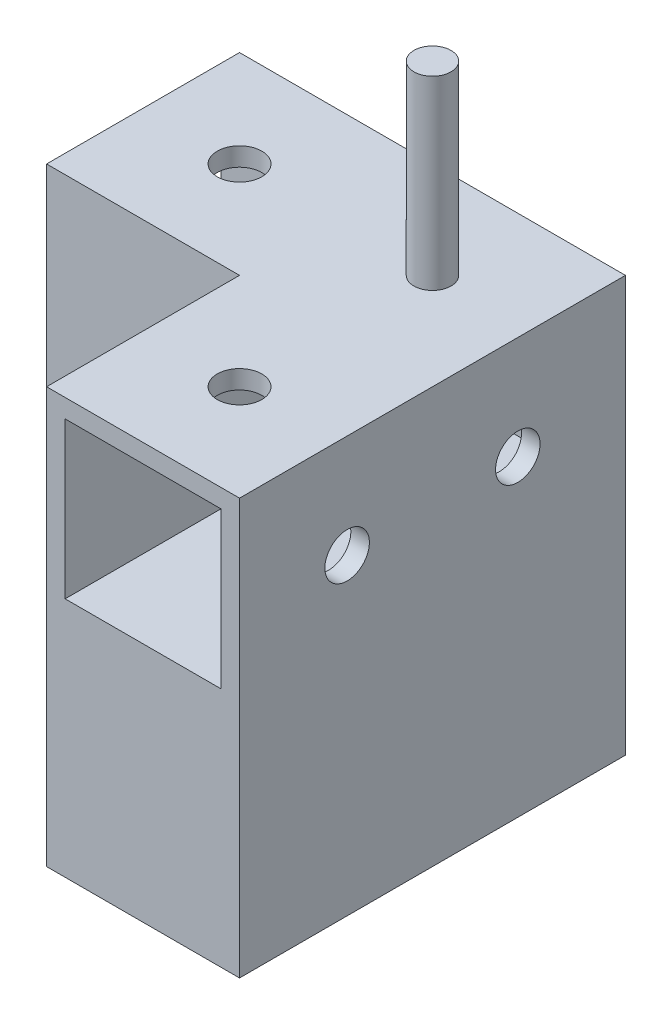
ISO-10303-21;
HEADER;
FILE_DESCRIPTION(('STEP AP214'),'2;1');
FILE_NAME('part.step','',(''),(''),'','','');
FILE_SCHEMA(('AUTOMOTIVE_DESIGN { 1 0 10303 214 1 1 1 1 }'));
ENDSEC;
DATA;
#1=APPLICATION_CONTEXT('core data for automotive mechanical design processes');
#2=APPLICATION_PROTOCOL_DEFINITION('international standard','automotive_design',2000,#1);
#3=PRODUCT_CONTEXT('',#1,'mechanical');
#4=PRODUCT('Part','Part','',(#3));
#5=PRODUCT_RELATED_PRODUCT_CATEGORY('part','',(#4));
#6=PRODUCT_DEFINITION_FORMATION('','',#4);
#7=PRODUCT_DEFINITION_CONTEXT('part definition',#1,'design');
#8=PRODUCT_DEFINITION('design','',#6,#7);
#9=PRODUCT_DEFINITION_SHAPE('','',#8);
#10=(LENGTH_UNIT() NAMED_UNIT(*) SI_UNIT(.MILLI.,.METRE.));
#11=(NAMED_UNIT(*) PLANE_ANGLE_UNIT() SI_UNIT($,.RADIAN.));
#12=(NAMED_UNIT(*) SI_UNIT($,.STERADIAN.) SOLID_ANGLE_UNIT());
#13=UNCERTAINTY_MEASURE_WITH_UNIT(LENGTH_MEASURE(1.E-05),#10,'distance_accuracy_value','');
#14=(GEOMETRIC_REPRESENTATION_CONTEXT(3) GLOBAL_UNCERTAINTY_ASSIGNED_CONTEXT((#13)) GLOBAL_UNIT_ASSIGNED_CONTEXT((#10,
#11,#12)) REPRESENTATION_CONTEXT('',''));
#15=CARTESIAN_POINT('',(0.,0.,0.));
#16=DIRECTION('',(0.,0.,1.));
#17=DIRECTION('',(1.,0.,0.));
#18=AXIS2_PLACEMENT_3D('',#15,#16,#17);
#19=CARTESIAN_POINT('',(-23.,-20.,-23.));
#20=DIRECTION('',(0.,0.,1.));
#21=DIRECTION('',(1.,0.,0.));
#22=AXIS2_PLACEMENT_3D('',#19,#20,#21);
#23=PLANE('',#22);
#24=DIRECTION('',(1.,0.,0.));
#25=VECTOR('',#24,1.);
#26=CARTESIAN_POINT('',(0.,0.5,-23.));
#27=LINE('',#26,#25);
#28=CARTESIAN_POINT('',(23.,0.500000000000001,-23.));
#29=VERTEX_POINT('',#28);
#30=CARTESIAN_POINT('',(23.5,0.500000000000004,-23.));
#31=VERTEX_POINT('',#30);
#32=EDGE_CURVE('E309',#29,#31,#27,.T.);
#33=ORIENTED_EDGE('',*,*,#32,.F.);
#34=DIRECTION('',(0.,-1.,0.));
#35=VECTOR('',#34,1.);
#36=CARTESIAN_POINT('',(23.,-20.,-23.));
#37=LINE('',#36,#35);
#38=CARTESIAN_POINT('',(23.,-20.5,-23.));
#39=VERTEX_POINT('',#38);
#40=EDGE_CURVE('E299',#29,#39,#37,.T.);
#41=ORIENTED_EDGE('',*,*,#40,.T.);
#42=DIRECTION('',(-1.,0.,0.));
#43=VECTOR('',#42,1.);
#44=CARTESIAN_POINT('',(0.,-20.5,-23.));
#45=LINE('',#44,#43);
#46=CARTESIAN_POINT('',(23.5,-20.5,-23.));
#47=VERTEX_POINT('',#46);
#48=EDGE_CURVE('E303',#47,#39,#45,.T.);
#49=ORIENTED_EDGE('',*,*,#48,.F.);
#50=DIRECTION('',(0.,-1.,0.));
#51=VECTOR('',#50,1.);
#52=CARTESIAN_POINT('',(23.5,0.,-23.));
#53=LINE('',#52,#51);
#54=EDGE_CURVE('E306',#31,#47,#53,.T.);
#55=ORIENTED_EDGE('',*,*,#54,.F.);
#56=EDGE_LOOP('',(#33,#41,#49,#55));
#57=FACE_BOUND('',#56,.T.);
#58=ADVANCED_FACE('F38',(#57),#23,.T.);
#59=CARTESIAN_POINT('',(26.,3.,26.));
#60=DIRECTION('',(-1.,0.,0.));
#61=DIRECTION('',(0.,0.,1.));
#62=AXIS2_PLACEMENT_3D('',#59,#60,#61);
#63=PLANE('',#62);
#64=DIRECTION('',(0.,0.,1.));
#65=VECTOR('',#64,1.);
#66=CARTESIAN_POINT('',(26.,-53.,-26.));
#67=LINE('',#66,#65);
#68=CARTESIAN_POINT('',(26.,-53.,-26.));
#69=VERTEX_POINT('',#68);
#70=CARTESIAN_POINT('',(26.,-53.,26.));
#71=VERTEX_POINT('',#70);
#72=EDGE_CURVE('E262',#69,#71,#67,.T.);
#73=ORIENTED_EDGE('',*,*,#72,.F.);
#74=DIRECTION('',(0.,-1.,0.));
#75=VECTOR('',#74,1.);
#76=CARTESIAN_POINT('',(26.,3.,-26.));
#77=LINE('',#76,#75);
#78=CARTESIAN_POINT('',(26.,3.,-26.));
#79=VERTEX_POINT('',#78);
#80=EDGE_CURVE('E362',#79,#69,#77,.T.);
#81=ORIENTED_EDGE('',*,*,#80,.F.);
#82=DIRECTION('',(0.,0.,-1.));
#83=VECTOR('',#82,1.);
#84=CARTESIAN_POINT('',(26.,3.,26.));
#85=LINE('',#84,#83);
#86=CARTESIAN_POINT('',(26.,3.,26.));
#87=VERTEX_POINT('',#86);
#88=EDGE_CURVE('E339',#87,#79,#85,.T.);
#89=ORIENTED_EDGE('',*,*,#88,.F.);
#90=DIRECTION('',(0.,-1.,0.));
#91=VECTOR('',#90,1.);
#92=CARTESIAN_POINT('',(26.,3.,26.));
#93=LINE('',#92,#91);
#94=EDGE_CURVE('E352',#87,#71,#93,.T.);
#95=ORIENTED_EDGE('',*,*,#94,.T.);
#96=EDGE_LOOP('',(#73,#81,#89,#95));
#97=FACE_BOUND('',#96,.T.);
#98=CARTESIAN_POINT('',(26.,-10.9174647759851,-11.5));
#99=DIRECTION('',(1.,0.,0.));
#100=DIRECTION('',(0.,0.,-1.));
#101=AXIS2_PLACEMENT_3D('',#98,#99,#100);
#102=CIRCLE('',#101,3.);
#103=CARTESIAN_POINT('',(26.,-10.9174647759851,-14.5));
#104=VERTEX_POINT('',#103);
#105=EDGE_CURVE('E222',#104,#104,#102,.T.);
#106=ORIENTED_EDGE('',*,*,#105,.F.);
#107=EDGE_LOOP('',(#106));
#108=FACE_BOUND('',#107,.T.);
#109=CARTESIAN_POINT('',(26.,-10.9174647759851,11.5));
#110=DIRECTION('',(1.,0.,0.));
#111=DIRECTION('',(0.,0.,-1.));
#112=AXIS2_PLACEMENT_3D('',#109,#110,#111);
#113=CIRCLE('',#112,3.);
#114=CARTESIAN_POINT('',(26.,-10.9174647759851,8.5));
#115=VERTEX_POINT('',#114);
#116=EDGE_CURVE('E230',#115,#115,#113,.T.);
#117=ORIENTED_EDGE('',*,*,#116,.F.);
#118=EDGE_LOOP('',(#117));
#119=FACE_BOUND('',#118,.T.);
#120=ADVANCED_FACE('F40',(#97,#108,#119),#63,.F.);
#121=CARTESIAN_POINT('',(-26.,3.,-26.));
#122=DIRECTION('',(0.,0.,1.));
#123=DIRECTION('',(1.,0.,0.));
#124=AXIS2_PLACEMENT_3D('',#121,#122,#123);
#125=PLANE('',#124);
#126=DIRECTION('',(1.,0.,0.));
#127=VECTOR('',#126,1.);
#128=CARTESIAN_POINT('',(-26.,-53.,-26.));
#129=LINE('',#128,#127);
#130=CARTESIAN_POINT('',(-26.,-53.,-26.));
#131=VERTEX_POINT('',#130);
#132=EDGE_CURVE('E259',#131,#69,#129,.T.);
#133=ORIENTED_EDGE('',*,*,#132,.F.);
#134=DIRECTION('',(0.,-1.,0.));
#135=VECTOR('',#134,1.);
#136=CARTESIAN_POINT('',(-26.,3.,-26.));
#137=LINE('',#136,#135);
#138=CARTESIAN_POINT('',(-26.,3.,-26.));
#139=VERTEX_POINT('',#138);
#140=EDGE_CURVE('E360',#139,#131,#137,.T.);
#141=ORIENTED_EDGE('',*,*,#140,.F.);
#142=DIRECTION('',(-1.,0.,0.));
#143=VECTOR('',#142,1.);
#144=CARTESIAN_POINT('',(-26.,3.,-26.));
#145=LINE('',#144,#143);
#146=EDGE_CURVE('E342',#79,#139,#145,.T.);
#147=ORIENTED_EDGE('',*,*,#146,.F.);
#148=ORIENTED_EDGE('',*,*,#80,.T.);
#149=EDGE_LOOP('',(#133,#141,#147,#148));
#150=FACE_BOUND('',#149,.T.);
#151=CARTESIAN_POINT('',(-13.,-9.99999999999999,-26.));
#152=DIRECTION('',(0.,0.,-1.));
#153=DIRECTION('',(-1.,0.,0.));
#154=AXIS2_PLACEMENT_3D('',#151,#152,#153);
#155=CIRCLE('',#154,3.);
#156=CARTESIAN_POINT('',(-16.,-9.99999999999999,-26.));
#157=VERTEX_POINT('',#156);
#158=EDGE_CURVE('E246',#157,#157,#155,.T.);
#159=ORIENTED_EDGE('',*,*,#158,.F.);
#160=EDGE_LOOP('',(#159));
#161=FACE_BOUND('',#160,.T.);
#162=CARTESIAN_POINT('',(13.,-10.,-26.));
#163=DIRECTION('',(0.,0.,-1.));
#164=DIRECTION('',(-1.,0.,0.));
#165=AXIS2_PLACEMENT_3D('',#162,#163,#164);
#166=CIRCLE('',#165,3.);
#167=CARTESIAN_POINT('',(9.99999999999999,-10.,-26.));
#168=VERTEX_POINT('',#167);
#169=EDGE_CURVE('E242',#168,#168,#166,.T.);
#170=ORIENTED_EDGE('',*,*,#169,.F.);
#171=EDGE_LOOP('',(#170));
#172=FACE_BOUND('',#171,.T.);
#173=ADVANCED_FACE('F405',(#150,#161,#172),#125,.F.);
#174=CARTESIAN_POINT('',(-26.,3.,0.));
#175=DIRECTION('',(1.,0.,0.));
#176=DIRECTION('',(0.,0.,-1.));
#177=AXIS2_PLACEMENT_3D('',#174,#175,#176);
#178=PLANE('',#177);
#179=DIRECTION('',(0.,0.,-1.));
#180=VECTOR('',#179,1.);
#181=CARTESIAN_POINT('',(-26.,-53.,0.));
#182=LINE('',#181,#180);
#183=CARTESIAN_POINT('',(-26.,-53.,0.));
#184=VERTEX_POINT('',#183);
#185=EDGE_CURVE('E256',#184,#131,#182,.T.);
#186=ORIENTED_EDGE('',*,*,#185,.F.);
#187=DIRECTION('',(0.,-1.,0.));
#188=VECTOR('',#187,1.);
#189=CARTESIAN_POINT('',(-26.,3.,0.));
#190=LINE('',#189,#188);
#191=CARTESIAN_POINT('',(-26.,3.,0.));
#192=VERTEX_POINT('',#191);
#193=EDGE_CURVE('E358',#192,#184,#190,.T.);
#194=ORIENTED_EDGE('',*,*,#193,.F.);
#195=DIRECTION('',(0.,0.,1.));
#196=VECTOR('',#195,1.);
#197=CARTESIAN_POINT('',(-26.,3.,0.));
#198=LINE('',#197,#196);
#199=EDGE_CURVE('E344',#139,#192,#198,.T.);
#200=ORIENTED_EDGE('',*,*,#199,.F.);
#201=ORIENTED_EDGE('',*,*,#140,.T.);
#202=EDGE_LOOP('',(#186,#194,#200,#201));
#203=FACE_BOUND('',#202,.T.);
#204=DIRECTION('',(0.,0.,-1.));
#205=VECTOR('',#204,1.);
#206=CARTESIAN_POINT('',(-26.,0.500000000000005,0.));
#207=LINE('',#206,#205);
#208=CARTESIAN_POINT('',(-26.,0.500000000000004,-2.5));
#209=VERTEX_POINT('',#208);
#210=CARTESIAN_POINT('',(-26.,0.5,-23.5));
#211=VERTEX_POINT('',#210);
#212=EDGE_CURVE('E278',#209,#211,#207,.T.);
#213=ORIENTED_EDGE('',*,*,#212,.F.);
#214=DIRECTION('',(0.,1.,0.));
#215=VECTOR('',#214,1.);
#216=CARTESIAN_POINT('',(-26.,0.,-2.5));
#217=LINE('',#216,#215);
#218=CARTESIAN_POINT('',(-26.,-20.5,-2.5));
#219=VERTEX_POINT('',#218);
#220=EDGE_CURVE('E61',#219,#209,#217,.T.);
#221=ORIENTED_EDGE('',*,*,#220,.F.);
#222=DIRECTION('',(0.,0.,1.));
#223=VECTOR('',#222,1.);
#224=CARTESIAN_POINT('',(-26.,-20.5,0.));
#225=LINE('',#224,#223);
#226=CARTESIAN_POINT('',(-26.,-20.5,-23.5));
#227=VERTEX_POINT('',#226);
#228=EDGE_CURVE('E284',#227,#219,#225,.T.);
#229=ORIENTED_EDGE('',*,*,#228,.F.);
#230=DIRECTION('',(0.,-1.,0.));
#231=VECTOR('',#230,1.);
#232=CARTESIAN_POINT('',(-26.,0.,-23.5));
#233=LINE('',#232,#231);
#234=EDGE_CURVE('E281',#211,#227,#233,.T.);
#235=ORIENTED_EDGE('',*,*,#234,.F.);
#236=EDGE_LOOP('',(#213,#221,#229,#235));
#237=FACE_BOUND('',#236,.T.);
#238=ADVANCED_FACE('F414',(#203,#237),#178,.F.);
#239=CARTESIAN_POINT('',(-26.,3.,0.));
#240=DIRECTION('',(0.,0.,-1.));
#241=DIRECTION('',(-1.,0.,0.));
#242=AXIS2_PLACEMENT_3D('',#239,#240,#241);
#243=PLANE('',#242);
#244=DIRECTION('',(-1.,0.,0.));
#245=VECTOR('',#244,1.);
#246=CARTESIAN_POINT('',(0.,-53.,0.));
#247=LINE('',#246,#245);
#248=CARTESIAN_POINT('',(0.,-53.,0.));
#249=VERTEX_POINT('',#248);
#250=EDGE_CURVE('E249',#249,#184,#247,.T.);
#251=ORIENTED_EDGE('',*,*,#250,.F.);
#252=DIRECTION('',(0.,-1.,0.));
#253=VECTOR('',#252,1.);
#254=CARTESIAN_POINT('',(0.,3.,0.));
#255=LINE('',#254,#253);
#256=CARTESIAN_POINT('',(0.,3.,0.));
#257=VERTEX_POINT('',#256);
#258=EDGE_CURVE('E356',#257,#249,#255,.T.);
#259=ORIENTED_EDGE('',*,*,#258,.F.);
#260=DIRECTION('',(1.,0.,0.));
#261=VECTOR('',#260,1.);
#262=CARTESIAN_POINT('',(-26.,3.,0.));
#263=LINE('',#262,#261);
#264=EDGE_CURVE('E346',#192,#257,#263,.T.);
#265=ORIENTED_EDGE('',*,*,#264,.F.);
#266=ORIENTED_EDGE('',*,*,#193,.T.);
#267=EDGE_LOOP('',(#251,#259,#265,#266));
#268=FACE_BOUND('',#267,.T.);
#269=ADVANCED_FACE('F422',(#268),#243,.F.);
#270=CARTESIAN_POINT('',(0.,3.,26.));
#271=DIRECTION('',(1.,0.,0.));
#272=DIRECTION('',(0.,0.,-1.));
#273=AXIS2_PLACEMENT_3D('',#270,#271,#272);
#274=PLANE('',#273);
#275=DIRECTION('',(0.,0.,-1.));
#276=VECTOR('',#275,1.);
#277=CARTESIAN_POINT('',(0.,-53.,26.));
#278=LINE('',#277,#276);
#279=CARTESIAN_POINT('',(0.,-53.,26.));
#280=VERTEX_POINT('',#279);
#281=EDGE_CURVE('E268',#280,#249,#278,.T.);
#282=ORIENTED_EDGE('',*,*,#281,.F.);
#283=DIRECTION('',(0.,-1.,0.));
#284=VECTOR('',#283,1.);
#285=CARTESIAN_POINT('',(0.,3.,26.));
#286=LINE('',#285,#284);
#287=CARTESIAN_POINT('',(0.,3.,26.));
#288=VERTEX_POINT('',#287);
#289=EDGE_CURVE('E354',#288,#280,#286,.T.);
#290=ORIENTED_EDGE('',*,*,#289,.F.);
#291=DIRECTION('',(0.,0.,1.));
#292=VECTOR('',#291,1.);
#293=CARTESIAN_POINT('',(0.,3.,26.));
#294=LINE('',#293,#292);
#295=EDGE_CURVE('E348',#257,#288,#294,.T.);
#296=ORIENTED_EDGE('',*,*,#295,.F.);
#297=ORIENTED_EDGE('',*,*,#258,.T.);
#298=EDGE_LOOP('',(#282,#290,#296,#297));
#299=FACE_BOUND('',#298,.T.);
#300=ADVANCED_FACE('F425',(#299),#274,.F.);
#301=CARTESIAN_POINT('',(0.,3.,26.));
#302=DIRECTION('',(0.,0.,-1.));
#303=DIRECTION('',(-1.,0.,0.));
#304=AXIS2_PLACEMENT_3D('',#301,#302,#303);
#305=PLANE('',#304);
#306=DIRECTION('',(-1.,0.,0.));
#307=VECTOR('',#306,1.);
#308=CARTESIAN_POINT('',(26.,-53.,26.));
#309=LINE('',#308,#307);
#310=EDGE_CURVE('E265',#71,#280,#309,.T.);
#311=ORIENTED_EDGE('',*,*,#310,.F.);
#312=ORIENTED_EDGE('',*,*,#94,.F.);
#313=DIRECTION('',(1.,0.,0.));
#314=VECTOR('',#313,1.);
#315=CARTESIAN_POINT('',(0.,3.,26.));
#316=LINE('',#315,#314);
#317=EDGE_CURVE('E350',#288,#87,#316,.T.);
#318=ORIENTED_EDGE('',*,*,#317,.F.);
#319=ORIENTED_EDGE('',*,*,#289,.T.);
#320=EDGE_LOOP('',(#311,#312,#318,#319));
#321=FACE_BOUND('',#320,.T.);
#322=DIRECTION('',(-1.,0.,0.));
#323=VECTOR('',#322,1.);
#324=CARTESIAN_POINT('',(0.,0.5,26.));
#325=LINE('',#324,#323);
#326=CARTESIAN_POINT('',(23.5,0.500000000000004,26.));
#327=VERTEX_POINT('',#326);
#328=CARTESIAN_POINT('',(2.5,0.5,26.));
#329=VERTEX_POINT('',#328);
#330=EDGE_CURVE('E311',#327,#329,#325,.T.);
#331=ORIENTED_EDGE('',*,*,#330,.F.);
#332=DIRECTION('',(0.,1.,0.));
#333=VECTOR('',#332,1.);
#334=CARTESIAN_POINT('',(23.5,0.,26.));
#335=LINE('',#334,#333);
#336=CARTESIAN_POINT('',(23.5,-20.5,26.));
#337=VERTEX_POINT('',#336);
#338=EDGE_CURVE('E302',#337,#327,#335,.T.);
#339=ORIENTED_EDGE('',*,*,#338,.F.);
#340=DIRECTION('',(1.,0.,0.));
#341=VECTOR('',#340,1.);
#342=CARTESIAN_POINT('',(0.,-20.5,26.));
#343=LINE('',#342,#341);
#344=CARTESIAN_POINT('',(2.5,-20.5,26.));
#345=VERTEX_POINT('',#344);
#346=EDGE_CURVE('E317',#345,#337,#343,.T.);
#347=ORIENTED_EDGE('',*,*,#346,.F.);
#348=DIRECTION('',(0.,-1.,0.));
#349=VECTOR('',#348,1.);
#350=CARTESIAN_POINT('',(2.5,0.,26.));
#351=LINE('',#350,#349);
#352=EDGE_CURVE('E314',#329,#345,#351,.T.);
#353=ORIENTED_EDGE('',*,*,#352,.F.);
#354=EDGE_LOOP('',(#331,#339,#347,#353));
#355=FACE_BOUND('',#354,.T.);
#356=ADVANCED_FACE('F389',(#321,#355),#305,.F.);
#357=CARTESIAN_POINT('',(0.,3.,0.));
#358=DIRECTION('',(0.,-1.,0.));
#359=DIRECTION('',(0.,0.,-1.));
#360=AXIS2_PLACEMENT_3D('',#357,#358,#359);
#361=PLANE('',#360);
#362=CARTESIAN_POINT('',(-13.,3.,-13.));
#363=DIRECTION('',(0.,1.,0.));
#364=DIRECTION('',(0.,0.,1.));
#365=AXIS2_PLACEMENT_3D('',#362,#363,#364);
#366=CIRCLE('',#365,3.);
#367=CARTESIAN_POINT('',(-13.,3.,-9.99999999999999));
#368=VERTEX_POINT('',#367);
#369=EDGE_CURVE('E330',#368,#368,#366,.T.);
#370=ORIENTED_EDGE('',*,*,#369,.F.);
#371=EDGE_LOOP('',(#370));
#372=FACE_BOUND('',#371,.T.);
#373=CARTESIAN_POINT('',(13.,3.,13.));
#374=DIRECTION('',(0.,1.,0.));
#375=DIRECTION('',(0.,0.,1.));
#376=AXIS2_PLACEMENT_3D('',#373,#374,#375);
#377=CIRCLE('',#376,3.);
#378=CARTESIAN_POINT('',(13.,3.,16.));
#379=VERTEX_POINT('',#378);
#380=EDGE_CURVE('E334',#379,#379,#377,.T.);
#381=ORIENTED_EDGE('',*,*,#380,.F.);
#382=EDGE_LOOP('',(#381));
#383=FACE_BOUND('',#382,.T.);
#384=CARTESIAN_POINT('',(13.,3.,-13.));
#385=DIRECTION('',(0.,-1.,0.));
#386=DIRECTION('',(0.,0.,-1.));
#387=AXIS2_PLACEMENT_3D('',#384,#385,#386);
#388=CIRCLE('',#387,2.5);
#389=CARTESIAN_POINT('',(13.,3.,-15.5));
#390=VERTEX_POINT('',#389);
#391=EDGE_CURVE('E46',#390,#390,#388,.F.);
#392=ORIENTED_EDGE('',*,*,#391,.F.);
#393=EDGE_LOOP('',(#392));
#394=FACE_BOUND('',#393,.T.);
#395=ORIENTED_EDGE('',*,*,#88,.T.);
#396=ORIENTED_EDGE('',*,*,#146,.T.);
#397=ORIENTED_EDGE('',*,*,#199,.T.);
#398=ORIENTED_EDGE('',*,*,#264,.T.);
#399=ORIENTED_EDGE('',*,*,#295,.T.);
#400=ORIENTED_EDGE('',*,*,#317,.T.);
#401=EDGE_LOOP('',(#395,#396,#397,#398,#399,#400));
#402=FACE_BOUND('',#401,.T.);
#403=ADVANCED_FACE('F385',(#372,#383,#394,#402),#361,.F.);
#404=CARTESIAN_POINT('',(13.,28.,-13.));
#405=DIRECTION('',(0.,-1.,0.));
#406=DIRECTION('',(0.,0.,-1.));
#407=AXIS2_PLACEMENT_3D('',#404,#405,#406);
#408=CYLINDRICAL_SURFACE('',#407,2.5);
#409=CARTESIAN_POINT('',(13.,28.,-13.));
#410=DIRECTION('',(0.,1.,0.));
#411=DIRECTION('',(0.,0.,1.));
#412=AXIS2_PLACEMENT_3D('',#409,#410,#411);
#413=CIRCLE('',#412,2.5);
#414=CARTESIAN_POINT('',(13.,28.,-10.5));
#415=VERTEX_POINT('',#414);
#416=EDGE_CURVE('E333',#415,#415,#413,.T.);
#417=ORIENTED_EDGE('',*,*,#416,.F.);
#418=EDGE_LOOP('',(#417));
#419=FACE_BOUND('',#418,.T.);
#420=ORIENTED_EDGE('',*,*,#391,.T.);
#421=EDGE_LOOP('',(#420));
#422=FACE_BOUND('',#421,.T.);
#423=ADVANCED_FACE('F388',(#419,#422),#408,.T.);
#424=CARTESIAN_POINT('',(13.,28.,-13.));
#425=DIRECTION('',(0.,1.,0.));
#426=DIRECTION('',(0.,0.,1.));
#427=AXIS2_PLACEMENT_3D('',#424,#425,#426);
#428=PLANE('',#427);
#429=ORIENTED_EDGE('',*,*,#416,.T.);
#430=EDGE_LOOP('',(#429));
#431=FACE_BOUND('',#430,.T.);
#432=ADVANCED_FACE('F469',(#431),#428,.T.);
#433=CARTESIAN_POINT('',(13.,-0.00100000000000013,13.));
#434=DIRECTION('',(0.,1.,0.));
#435=DIRECTION('',(0.,0.,1.));
#436=AXIS2_PLACEMENT_3D('',#433,#434,#435);
#437=CYLINDRICAL_SURFACE('',#436,3.);
#438=CARTESIAN_POINT('',(13.,0.500000000000002,13.));
#439=DIRECTION('',(0.,1.,0.));
#440=DIRECTION('',(-1.,0.,0.));
#441=AXIS2_PLACEMENT_3D('',#438,#439,#440);
#442=CIRCLE('',#441,3.);
#443=CARTESIAN_POINT('',(13.,0.500000000000002,16.));
#444=VERTEX_POINT('',#443);
#445=EDGE_CURVE('E329',#444,#444,#442,.F.);
#446=CARTESIAN_POINT('',(13.,0.500000000000002,16.));
#447=CARTESIAN_POINT('',(13.,0.526041666666669,16.));
#448=CARTESIAN_POINT('',(13.,0.552083333333336,16.));
#449=CARTESIAN_POINT('',(13.,0.604166666666669,16.));
#450=CARTESIAN_POINT('',(13.,0.630208333333336,16.));
#451=CARTESIAN_POINT('',(13.,0.682291666666669,16.));
#452=CARTESIAN_POINT('',(13.,0.708333333333335,16.));
#453=CARTESIAN_POINT('',(13.,0.760416666666669,16.));
#454=CARTESIAN_POINT('',(13.,0.786458333333335,16.));
#455=CARTESIAN_POINT('',(13.,0.838541666666669,16.));
#456=CARTESIAN_POINT('',(13.,0.864583333333335,16.));
#457=CARTESIAN_POINT('',(13.,0.916666666666669,16.));
#458=CARTESIAN_POINT('',(13.,0.942708333333335,16.));
#459=CARTESIAN_POINT('',(13.,0.994791666666668,16.));
#460=CARTESIAN_POINT('',(13.,1.02083333333334,16.));
#461=CARTESIAN_POINT('',(13.,1.07291666666667,16.));
#462=CARTESIAN_POINT('',(13.,1.09895833333334,16.));
#463=CARTESIAN_POINT('',(13.,1.15104166666667,16.));
#464=CARTESIAN_POINT('',(13.,1.17708333333334,16.));
#465=CARTESIAN_POINT('',(13.,1.22916666666667,16.));
#466=CARTESIAN_POINT('',(13.,1.25520833333334,16.));
#467=CARTESIAN_POINT('',(13.,1.30729166666667,16.));
#468=CARTESIAN_POINT('',(13.,1.33333333333333,16.));
#469=CARTESIAN_POINT('',(13.,1.38541666666667,16.));
#470=CARTESIAN_POINT('',(13.,1.41145833333333,16.));
#471=CARTESIAN_POINT('',(13.,1.46354166666667,16.));
#472=CARTESIAN_POINT('',(13.,1.48958333333333,16.));
#473=CARTESIAN_POINT('',(13.,1.54166666666667,16.));
#474=CARTESIAN_POINT('',(13.,1.56770833333333,16.));
#475=CARTESIAN_POINT('',(13.,1.61979166666667,16.));
#476=CARTESIAN_POINT('',(13.,1.64583333333333,16.));
#477=CARTESIAN_POINT('',(13.,1.69791666666667,16.));
#478=CARTESIAN_POINT('',(13.,1.72395833333333,16.));
#479=CARTESIAN_POINT('',(13.,1.77604166666667,16.));
#480=CARTESIAN_POINT('',(13.,1.80208333333333,16.));
#481=CARTESIAN_POINT('',(13.,1.85416666666667,16.));
#482=CARTESIAN_POINT('',(13.,1.88020833333333,16.));
#483=CARTESIAN_POINT('',(13.,1.93229166666667,16.));
#484=CARTESIAN_POINT('',(13.,1.95833333333333,16.));
#485=CARTESIAN_POINT('',(13.,2.01041666666667,16.));
#486=CARTESIAN_POINT('',(13.,2.03645833333333,16.));
#487=CARTESIAN_POINT('',(13.,2.08854166666667,16.));
#488=CARTESIAN_POINT('',(13.,2.11458333333333,16.));
#489=CARTESIAN_POINT('',(13.,2.16666666666667,16.));
#490=CARTESIAN_POINT('',(13.,2.19270833333333,16.));
#491=CARTESIAN_POINT('',(13.,2.24479166666667,16.));
#492=CARTESIAN_POINT('',(13.,2.27083333333333,16.));
#493=CARTESIAN_POINT('',(13.,2.32291666666667,16.));
#494=CARTESIAN_POINT('',(13.,2.34895833333333,16.));
#495=CARTESIAN_POINT('',(13.,2.40104166666667,16.));
#496=CARTESIAN_POINT('',(13.,2.42708333333333,16.));
#497=CARTESIAN_POINT('',(13.,2.47916666666667,16.));
#498=CARTESIAN_POINT('',(13.,2.50520833333333,16.));
#499=CARTESIAN_POINT('',(13.,2.55729166666667,16.));
#500=CARTESIAN_POINT('',(13.,2.58333333333333,16.));
#501=CARTESIAN_POINT('',(13.,2.63541666666667,16.));
#502=CARTESIAN_POINT('',(13.,2.66145833333333,16.));
#503=CARTESIAN_POINT('',(13.,2.71354166666667,16.));
#504=CARTESIAN_POINT('',(13.,2.73958333333333,16.));
#505=CARTESIAN_POINT('',(13.,2.79166666666667,16.));
#506=CARTESIAN_POINT('',(13.,2.81770833333333,16.));
#507=CARTESIAN_POINT('',(13.,2.86979166666667,16.));
#508=CARTESIAN_POINT('',(13.,2.89583333333333,16.));
#509=CARTESIAN_POINT('',(13.,2.94791666666667,16.));
#510=CARTESIAN_POINT('',(13.,2.97395833333333,16.));
#511=CARTESIAN_POINT('',(13.,3.,16.));
#512=B_SPLINE_CURVE_WITH_KNOTS('',3,(#446,#447,#448,#449,#450,#451,#452,#453,#454,#455,#456,
#457,#458,#459,#460,#461,#462,#463,#464,#465,#466,#467,#468,#469,#470,#471,#472,#473,#474,#475,
#476,#477,#478,#479,#480,#481,#482,#483,#484,#485,#486,#487,#488,#489,#490,#491,#492,#493,#494,
#495,#496,#497,#498,#499,#500,#501,#502,#503,#504,#505,#506,#507,#508,#509,#510,#511),
.UNSPECIFIED.,.F.,.F.,(4,2,2,2,2,2,2,2,2,2,2,2,2,2,2,2,2,2,2,2,2,2,2,2,2,2,2,2,2,2,2,2,4),(0.,
0.078125,0.15625,0.234375,0.3125,0.390625,0.46875,0.546874999999999,0.624999999999999,
0.703124999999999,0.781249999999999,0.859374999999999,0.937499999999999,1.015625,1.09375,
1.171875,1.25,1.328125,1.40625,1.484375,1.5625,1.640625,1.71875,1.796875,1.875,1.953125,2.03125,
2.109375,2.1875,2.265625,2.34375,2.421875,2.5),.UNSPECIFIED.);
#513=EDGE_CURVE('BSEAM368',#444,#379,#512,.T.);
#514=ORIENTED_EDGE('',*,*,#445,.T.);
#515=ORIENTED_EDGE('',*,*,#380,.T.);
#516=ORIENTED_EDGE('',*,*,#513,.T.);
#517=ORIENTED_EDGE('',*,*,#513,.F.);
#518=EDGE_LOOP('',(#514,#516,#515,#517));
#519=FACE_BOUND('',#518,.T.);
#520=ADVANCED_FACE('F368',(#519),#437,.F.);
#521=CARTESIAN_POINT('',(-13.,-0.00100000000000013,-13.));
#522=DIRECTION('',(0.,1.,0.));
#523=DIRECTION('',(0.,0.,1.));
#524=AXIS2_PLACEMENT_3D('',#521,#522,#523);
#525=CYLINDRICAL_SURFACE('',#524,3.);
#526=CARTESIAN_POINT('',(-13.,0.500000000000002,-13.));
#527=DIRECTION('',(0.,1.,0.));
#528=DIRECTION('',(0.,0.,1.));
#529=AXIS2_PLACEMENT_3D('',#526,#527,#528);
#530=CIRCLE('',#529,3.);
#531=CARTESIAN_POINT('',(-13.,0.500000000000003,-9.99999999999999));
#532=VERTEX_POINT('',#531);
#533=EDGE_CURVE('E296',#532,#532,#530,.F.);
#534=CARTESIAN_POINT('',(-13.,0.500000000000003,-9.99999999999999));
#535=CARTESIAN_POINT('',(-13.,0.52604166666667,-9.99999999999999));
#536=CARTESIAN_POINT('',(-13.,0.552083333333336,-9.99999999999999));
#537=CARTESIAN_POINT('',(-13.,0.604166666666669,-9.99999999999999));
#538=CARTESIAN_POINT('',(-13.,0.630208333333336,-9.99999999999999));
#539=CARTESIAN_POINT('',(-13.,0.682291666666669,-9.99999999999999));
#540=CARTESIAN_POINT('',(-13.,0.708333333333336,-9.99999999999999));
#541=CARTESIAN_POINT('',(-13.,0.760416666666669,-9.99999999999999));
#542=CARTESIAN_POINT('',(-13.,0.786458333333336,-9.99999999999999));
#543=CARTESIAN_POINT('',(-13.,0.838541666666669,-9.99999999999999));
#544=CARTESIAN_POINT('',(-13.,0.864583333333336,-9.99999999999999));
#545=CARTESIAN_POINT('',(-13.,0.916666666666669,-9.99999999999999));
#546=CARTESIAN_POINT('',(-13.,0.942708333333336,-9.99999999999999));
#547=CARTESIAN_POINT('',(-13.,0.994791666666669,-9.99999999999999));
#548=CARTESIAN_POINT('',(-13.,1.02083333333334,-9.99999999999999));
#549=CARTESIAN_POINT('',(-13.,1.07291666666667,-9.99999999999999));
#550=CARTESIAN_POINT('',(-13.,1.09895833333334,-9.99999999999999));
#551=CARTESIAN_POINT('',(-13.,1.15104166666667,-9.99999999999999));
#552=CARTESIAN_POINT('',(-13.,1.17708333333334,-9.99999999999999));
#553=CARTESIAN_POINT('',(-13.,1.22916666666667,-9.99999999999999));
#554=CARTESIAN_POINT('',(-13.,1.25520833333334,-9.99999999999999));
#555=CARTESIAN_POINT('',(-13.,1.30729166666667,-9.99999999999999));
#556=CARTESIAN_POINT('',(-13.,1.33333333333334,-9.99999999999999));
#557=CARTESIAN_POINT('',(-13.,1.38541666666667,-9.99999999999999));
#558=CARTESIAN_POINT('',(-13.,1.41145833333334,-9.99999999999999));
#559=CARTESIAN_POINT('',(-13.,1.46354166666667,-9.99999999999999));
#560=CARTESIAN_POINT('',(-13.,1.48958333333334,-9.99999999999999));
#561=CARTESIAN_POINT('',(-13.,1.54166666666667,-9.99999999999999));
#562=CARTESIAN_POINT('',(-13.,1.56770833333334,-9.99999999999999));
#563=CARTESIAN_POINT('',(-13.,1.61979166666667,-9.99999999999999));
#564=CARTESIAN_POINT('',(-13.,1.64583333333333,-9.99999999999999));
#565=CARTESIAN_POINT('',(-13.,1.69791666666667,-9.99999999999999));
#566=CARTESIAN_POINT('',(-13.,1.72395833333333,-9.99999999999999));
#567=CARTESIAN_POINT('',(-13.,1.77604166666667,-9.99999999999999));
#568=CARTESIAN_POINT('',(-13.,1.80208333333333,-9.99999999999999));
#569=CARTESIAN_POINT('',(-13.,1.85416666666667,-9.99999999999999));
#570=CARTESIAN_POINT('',(-13.,1.88020833333333,-9.99999999999999));
#571=CARTESIAN_POINT('',(-13.,1.93229166666667,-9.99999999999999));
#572=CARTESIAN_POINT('',(-13.,1.95833333333333,-9.99999999999999));
#573=CARTESIAN_POINT('',(-13.,2.01041666666667,-9.99999999999999));
#574=CARTESIAN_POINT('',(-13.,2.03645833333333,-9.99999999999999));
#575=CARTESIAN_POINT('',(-13.,2.08854166666667,-9.99999999999999));
#576=CARTESIAN_POINT('',(-13.,2.11458333333333,-9.99999999999999));
#577=CARTESIAN_POINT('',(-13.,2.16666666666667,-9.99999999999999));
#578=CARTESIAN_POINT('',(-13.,2.19270833333333,-9.99999999999999));
#579=CARTESIAN_POINT('',(-13.,2.24479166666667,-9.99999999999999));
#580=CARTESIAN_POINT('',(-13.,2.27083333333333,-9.99999999999999));
#581=CARTESIAN_POINT('',(-13.,2.32291666666667,-9.99999999999999));
#582=CARTESIAN_POINT('',(-13.,2.34895833333333,-9.99999999999999));
#583=CARTESIAN_POINT('',(-13.,2.40104166666667,-9.99999999999999));
#584=CARTESIAN_POINT('',(-13.,2.42708333333333,-9.99999999999999));
#585=CARTESIAN_POINT('',(-13.,2.47916666666667,-9.99999999999999));
#586=CARTESIAN_POINT('',(-13.,2.50520833333333,-9.99999999999999));
#587=CARTESIAN_POINT('',(-13.,2.55729166666667,-9.99999999999999));
#588=CARTESIAN_POINT('',(-13.,2.58333333333333,-9.99999999999999));
#589=CARTESIAN_POINT('',(-13.,2.63541666666667,-9.99999999999999));
#590=CARTESIAN_POINT('',(-13.,2.66145833333333,-9.99999999999999));
#591=CARTESIAN_POINT('',(-13.,2.71354166666667,-9.99999999999999));
#592=CARTESIAN_POINT('',(-13.,2.73958333333333,-9.99999999999999));
#593=CARTESIAN_POINT('',(-13.,2.79166666666667,-9.99999999999999));
#594=CARTESIAN_POINT('',(-13.,2.81770833333333,-9.99999999999999));
#595=CARTESIAN_POINT('',(-13.,2.86979166666667,-9.99999999999999));
#596=CARTESIAN_POINT('',(-13.,2.89583333333333,-9.99999999999999));
#597=CARTESIAN_POINT('',(-13.,2.94791666666667,-9.99999999999999));
#598=CARTESIAN_POINT('',(-13.,2.97395833333333,-9.99999999999999));
#599=CARTESIAN_POINT('',(-13.,3.,-9.99999999999999));
#600=B_SPLINE_CURVE_WITH_KNOTS('',3,(#534,#535,#536,#537,#538,#539,#540,#541,#542,#543,#544,
#545,#546,#547,#548,#549,#550,#551,#552,#553,#554,#555,#556,#557,#558,#559,#560,#561,#562,#563,
#564,#565,#566,#567,#568,#569,#570,#571,#572,#573,#574,#575,#576,#577,#578,#579,#580,#581,#582,
#583,#584,#585,#586,#587,#588,#589,#590,#591,#592,#593,#594,#595,#596,#597,#598,#599),
.UNSPECIFIED.,.F.,.F.,(4,2,2,2,2,2,2,2,2,2,2,2,2,2,2,2,2,2,2,2,2,2,2,2,2,2,2,2,2,2,2,2,4),(0.,
0.0781249999999998,0.15625,0.234375,0.3125,0.390625,0.468749999999999,0.546874999999999,
0.624999999999999,0.703124999999999,0.781249999999999,0.859374999999999,0.937499999999999,
1.015625,1.09375,1.171875,1.25,1.328125,1.40625,1.484375,1.5625,1.640625,1.71875,1.796875,1.875,
1.953125,2.03125,2.109375,2.1875,2.265625,2.34375,2.421875,2.5),.UNSPECIFIED.);
#601=EDGE_CURVE('BSEAM375',#532,#368,#600,.T.);
#602=ORIENTED_EDGE('',*,*,#533,.T.);
#603=ORIENTED_EDGE('',*,*,#369,.T.);
#604=ORIENTED_EDGE('',*,*,#601,.T.);
#605=ORIENTED_EDGE('',*,*,#601,.F.);
#606=EDGE_LOOP('',(#602,#604,#603,#605));
#607=FACE_BOUND('',#606,.T.);
#608=ADVANCED_FACE('F375',(#607),#525,.F.);
#609=CARTESIAN_POINT('',(0.,0.5,-55.698484809835));
#610=DIRECTION('',(0.,1.,0.));
#611=DIRECTION('',(-1.,0.,0.));
#612=AXIS2_PLACEMENT_3D('',#609,#610,#611);
#613=PLANE('',#612);
#614=DIRECTION('',(0.,0.,1.));
#615=VECTOR('',#614,1.);
#616=CARTESIAN_POINT('',(23.,0.500000000000005,0.));
#617=LINE('',#616,#615);
#618=CARTESIAN_POINT('',(23.,0.5,-23.5));
#619=VERTEX_POINT('',#618);
#620=EDGE_CURVE('E276',#619,#29,#617,.T.);
#621=ORIENTED_EDGE('',*,*,#620,.T.);
#622=ORIENTED_EDGE('',*,*,#32,.T.);
#623=DIRECTION('',(0.,0.,1.));
#624=VECTOR('',#623,1.);
#625=CARTESIAN_POINT('',(23.5,0.500000000000004,-55.698484809835));
#626=LINE('',#625,#624);
#627=EDGE_CURVE('E320',#31,#327,#626,.T.);
#628=ORIENTED_EDGE('',*,*,#627,.T.);
#629=ORIENTED_EDGE('',*,*,#330,.T.);
#630=DIRECTION('',(0.,0.,1.));
#631=VECTOR('',#630,1.);
#632=CARTESIAN_POINT('',(2.5,0.5,-55.698484809835));
#633=LINE('',#632,#631);
#634=CARTESIAN_POINT('',(2.5,0.500000000000004,-2.5));
#635=VERTEX_POINT('',#634);
#636=EDGE_CURVE('E324',#635,#329,#633,.T.);
#637=ORIENTED_EDGE('',*,*,#636,.F.);
#638=DIRECTION('',(-1.,0.,0.));
#639=VECTOR('',#638,1.);
#640=CARTESIAN_POINT('',(55.698484809835,0.500000000000004,-2.5));
#641=LINE('',#640,#639);
#642=EDGE_CURVE('E287',#635,#209,#641,.T.);
#643=ORIENTED_EDGE('',*,*,#642,.T.);
#644=ORIENTED_EDGE('',*,*,#212,.T.);
#645=DIRECTION('',(-1.,0.,0.));
#646=VECTOR('',#645,1.);
#647=CARTESIAN_POINT('',(55.698484809835,0.5,-23.5));
#648=LINE('',#647,#646);
#649=EDGE_CURVE('E291',#619,#211,#648,.T.);
#650=ORIENTED_EDGE('',*,*,#649,.F.);
#651=EDGE_LOOP('',(#621,#622,#628,#629,#637,#643,#644,#650));
#652=FACE_BOUND('',#651,.T.);
#653=ORIENTED_EDGE('',*,*,#445,.F.);
#654=EDGE_LOOP('',(#653));
#655=FACE_BOUND('',#654,.T.);
#656=ORIENTED_EDGE('',*,*,#533,.F.);
#657=EDGE_LOOP('',(#656));
#658=FACE_BOUND('',#657,.T.);
#659=ADVANCED_FACE('F371',(#652,#655,#658),#613,.F.);
#660=CARTESIAN_POINT('',(23.5,0.,-55.698484809835));
#661=DIRECTION('',(1.,0.,0.));
#662=DIRECTION('',(0.,0.,-1.));
#663=AXIS2_PLACEMENT_3D('',#660,#661,#662);
#664=PLANE('',#663);
#665=CARTESIAN_POINT('',(23.5,-10.9174647759851,11.5));
#666=DIRECTION('',(1.,0.,0.));
#667=DIRECTION('',(0.,0.,-1.));
#668=AXIS2_PLACEMENT_3D('',#665,#666,#667);
#669=CIRCLE('',#668,3.);
#670=CARTESIAN_POINT('',(23.5,-10.9174647759851,8.5));
#671=VERTEX_POINT('',#670);
#672=EDGE_CURVE('E233',#671,#671,#669,.F.);
#673=ORIENTED_EDGE('',*,*,#672,.F.);
#674=EDGE_LOOP('',(#673));
#675=FACE_BOUND('',#674,.T.);
#676=CARTESIAN_POINT('',(23.5,-10.9174647759851,-11.5));
#677=DIRECTION('',(1.,0.,0.));
#678=DIRECTION('',(0.,0.,-1.));
#679=AXIS2_PLACEMENT_3D('',#676,#677,#678);
#680=CIRCLE('',#679,3.);
#681=CARTESIAN_POINT('',(23.5,-10.9174647759851,-14.5));
#682=VERTEX_POINT('',#681);
#683=EDGE_CURVE('E234',#682,#682,#680,.F.);
#684=ORIENTED_EDGE('',*,*,#683,.F.);
#685=EDGE_LOOP('',(#684));
#686=FACE_BOUND('',#685,.T.);
#687=ORIENTED_EDGE('',*,*,#54,.T.);
#688=DIRECTION('',(0.,0.,1.));
#689=VECTOR('',#688,1.);
#690=CARTESIAN_POINT('',(23.5,-20.5,-55.698484809835));
#691=LINE('',#690,#689);
#692=EDGE_CURVE('E307',#47,#337,#691,.T.);
#693=ORIENTED_EDGE('',*,*,#692,.T.);
#694=ORIENTED_EDGE('',*,*,#338,.T.);
#695=ORIENTED_EDGE('',*,*,#627,.F.);
#696=EDGE_LOOP('',(#687,#693,#694,#695));
#697=FACE_BOUND('',#696,.T.);
#698=ADVANCED_FACE('F374',(#675,#686,#697),#664,.F.);
#699=CARTESIAN_POINT('',(0.,-20.5,-55.698484809835));
#700=DIRECTION('',(0.,-1.,0.));
#701=DIRECTION('',(0.,0.,-1.));
#702=AXIS2_PLACEMENT_3D('',#699,#700,#701);
#703=PLANE('',#702);
#704=ORIENTED_EDGE('',*,*,#48,.T.);
#705=DIRECTION('',(0.,0.,-1.));
#706=VECTOR('',#705,1.);
#707=CARTESIAN_POINT('',(23.,-20.5,0.));
#708=LINE('',#707,#706);
#709=CARTESIAN_POINT('',(23.,-20.5,-23.5));
#710=VERTEX_POINT('',#709);
#711=EDGE_CURVE('E273',#39,#710,#708,.T.);
#712=ORIENTED_EDGE('',*,*,#711,.T.);
#713=DIRECTION('',(-1.,0.,0.));
#714=VECTOR('',#713,1.);
#715=CARTESIAN_POINT('',(55.698484809835,-20.5,-23.5));
#716=LINE('',#715,#714);
#717=EDGE_CURVE('E289',#710,#227,#716,.T.);
#718=ORIENTED_EDGE('',*,*,#717,.T.);
#719=ORIENTED_EDGE('',*,*,#228,.T.);
#720=DIRECTION('',(-1.,0.,0.));
#721=VECTOR('',#720,1.);
#722=CARTESIAN_POINT('',(55.698484809835,-20.5,-2.5));
#723=LINE('',#722,#721);
#724=CARTESIAN_POINT('',(2.5,-20.5,-2.5));
#725=VERTEX_POINT('',#724);
#726=EDGE_CURVE('E274',#725,#219,#723,.T.);
#727=ORIENTED_EDGE('',*,*,#726,.F.);
#728=DIRECTION('',(0.,0.,1.));
#729=VECTOR('',#728,1.);
#730=CARTESIAN_POINT('',(2.5,-20.5,-55.698484809835));
#731=LINE('',#730,#729);
#732=EDGE_CURVE('E322',#725,#345,#731,.T.);
#733=ORIENTED_EDGE('',*,*,#732,.T.);
#734=ORIENTED_EDGE('',*,*,#346,.T.);
#735=ORIENTED_EDGE('',*,*,#692,.F.);
#736=EDGE_LOOP('',(#704,#712,#718,#719,#727,#733,#734,#735));
#737=FACE_BOUND('',#736,.T.);
#738=ADVANCED_FACE('F442',(#737),#703,.F.);
#739=CARTESIAN_POINT('',(2.5,0.,-55.698484809835));
#740=DIRECTION('',(-1.,0.,0.));
#741=DIRECTION('',(0.,-1.,0.));
#742=AXIS2_PLACEMENT_3D('',#739,#740,#741);
#743=PLANE('',#742);
#744=ORIENTED_EDGE('',*,*,#732,.F.);
#745=DIRECTION('',(0.,1.,0.));
#746=VECTOR('',#745,1.);
#747=CARTESIAN_POINT('',(2.5,0.,-2.5));
#748=LINE('',#747,#746);
#749=EDGE_CURVE('E13',#725,#635,#748,.T.);
#750=ORIENTED_EDGE('',*,*,#749,.T.);
#751=ORIENTED_EDGE('',*,*,#636,.T.);
#752=ORIENTED_EDGE('',*,*,#352,.T.);
#753=EDGE_LOOP('',(#744,#750,#751,#752));
#754=FACE_BOUND('',#753,.T.);
#755=ADVANCED_FACE('F446',(#754),#743,.F.);
#756=CARTESIAN_POINT('',(55.698484809835,0.,-2.5));
#757=DIRECTION('',(0.,0.,1.));
#758=DIRECTION('',(1.,0.,0.));
#759=AXIS2_PLACEMENT_3D('',#756,#757,#758);
#760=PLANE('',#759);
#761=ORIENTED_EDGE('',*,*,#726,.T.);
#762=ORIENTED_EDGE('',*,*,#220,.T.);
#763=ORIENTED_EDGE('',*,*,#642,.F.);
#764=ORIENTED_EDGE('',*,*,#749,.F.);
#765=EDGE_LOOP('',(#761,#762,#763,#764));
#766=FACE_BOUND('',#765,.T.);
#767=ADVANCED_FACE('F447',(#766),#760,.F.);
#768=CARTESIAN_POINT('',(55.698484809835,0.,-23.5));
#769=DIRECTION('',(0.,0.,-1.));
#770=DIRECTION('',(0.,1.,0.));
#771=AXIS2_PLACEMENT_3D('',#768,#769,#770);
#772=PLANE('',#771);
#773=CARTESIAN_POINT('',(13.,-10.,-23.5));
#774=DIRECTION('',(0.,0.,-1.));
#775=DIRECTION('',(0.,1.,0.));
#776=AXIS2_PLACEMENT_3D('',#773,#774,#775);
#777=CIRCLE('',#776,3.);
#778=CARTESIAN_POINT('',(13.,-7.,-23.5));
#779=VERTEX_POINT('',#778);
#780=EDGE_CURVE('E245',#779,#779,#777,.F.);
#781=ORIENTED_EDGE('',*,*,#780,.F.);
#782=EDGE_LOOP('',(#781));
#783=FACE_BOUND('',#782,.T.);
#784=CARTESIAN_POINT('',(-13.,-9.99999999999999,-23.5));
#785=DIRECTION('',(0.,0.,-1.));
#786=DIRECTION('',(0.,1.,0.));
#787=AXIS2_PLACEMENT_3D('',#784,#785,#786);
#788=CIRCLE('',#787,3.);
#789=CARTESIAN_POINT('',(-13.,-6.99999999999999,-23.5));
#790=VERTEX_POINT('',#789);
#791=EDGE_CURVE('E237',#790,#790,#788,.F.);
#792=ORIENTED_EDGE('',*,*,#791,.F.);
#793=EDGE_LOOP('',(#792));
#794=FACE_BOUND('',#793,.T.);
#795=DIRECTION('',(0.,1.,0.));
#796=VECTOR('',#795,1.);
#797=CARTESIAN_POINT('',(23.,0.,-23.5));
#798=LINE('',#797,#796);
#799=EDGE_CURVE('E271',#710,#619,#798,.T.);
#800=ORIENTED_EDGE('',*,*,#799,.T.);
#801=ORIENTED_EDGE('',*,*,#649,.T.);
#802=ORIENTED_EDGE('',*,*,#234,.T.);
#803=ORIENTED_EDGE('',*,*,#717,.F.);
#804=EDGE_LOOP('',(#800,#801,#802,#803));
#805=FACE_BOUND('',#804,.T.);
#806=ADVANCED_FACE('F454',(#783,#794,#805),#772,.F.);
#807=CARTESIAN_POINT('',(23.,3.,26.));
#808=DIRECTION('',(-1.,0.,0.));
#809=DIRECTION('',(0.,0.,1.));
#810=AXIS2_PLACEMENT_3D('',#807,#808,#809);
#811=PLANE('',#810);
#812=ORIENTED_EDGE('',*,*,#620,.F.);
#813=ORIENTED_EDGE('',*,*,#799,.F.);
#814=ORIENTED_EDGE('',*,*,#711,.F.);
#815=ORIENTED_EDGE('',*,*,#40,.F.);
#816=EDGE_LOOP('',(#812,#813,#814,#815));
#817=FACE_BOUND('',#816,.T.);
#818=ADVANCED_FACE('F458',(#817),#811,.T.);
#819=CARTESIAN_POINT('',(0.,-53.,0.));
#820=DIRECTION('',(0.,-1.,0.));
#821=DIRECTION('',(0.,0.,-1.));
#822=AXIS2_PLACEMENT_3D('',#819,#820,#821);
#823=PLANE('',#822);
#824=DIRECTION('',(0.,0.,-1.));
#825=VECTOR('',#824,1.);
#826=CARTESIAN_POINT('',(5.,-53.,21.));
#827=LINE('',#826,#825);
#828=CARTESIAN_POINT('',(5.,-53.,21.));
#829=VERTEX_POINT('',#828);
#830=CARTESIAN_POINT('',(5.,-53.,-5.));
#831=VERTEX_POINT('',#830);
#832=EDGE_CURVE('E53',#829,#831,#827,.T.);
#833=ORIENTED_EDGE('',*,*,#832,.F.);
#834=DIRECTION('',(-1.,0.,0.));
#835=VECTOR('',#834,1.);
#836=CARTESIAN_POINT('',(21.,-53.,21.));
#837=LINE('',#836,#835);
#838=CARTESIAN_POINT('',(21.,-53.,21.));
#839=VERTEX_POINT('',#838);
#840=EDGE_CURVE('E196',#839,#829,#837,.T.);
#841=ORIENTED_EDGE('',*,*,#840,.F.);
#842=DIRECTION('',(0.,0.,1.));
#843=VECTOR('',#842,1.);
#844=CARTESIAN_POINT('',(21.,-53.,-21.));
#845=LINE('',#844,#843);
#846=CARTESIAN_POINT('',(21.,-53.,-21.));
#847=VERTEX_POINT('',#846);
#848=EDGE_CURVE('E199',#847,#839,#845,.T.);
#849=ORIENTED_EDGE('',*,*,#848,.F.);
#850=DIRECTION('',(1.,0.,0.));
#851=VECTOR('',#850,1.);
#852=CARTESIAN_POINT('',(-21.,-53.,-21.));
#853=LINE('',#852,#851);
#854=CARTESIAN_POINT('',(-21.,-53.,-21.));
#855=VERTEX_POINT('',#854);
#856=EDGE_CURVE('E215',#855,#847,#853,.T.);
#857=ORIENTED_EDGE('',*,*,#856,.F.);
#858=DIRECTION('',(0.,0.,-1.));
#859=VECTOR('',#858,1.);
#860=CARTESIAN_POINT('',(-21.,-53.,-5.));
#861=LINE('',#860,#859);
#862=CARTESIAN_POINT('',(-21.,-53.,-5.));
#863=VERTEX_POINT('',#862);
#864=EDGE_CURVE('E212',#863,#855,#861,.T.);
#865=ORIENTED_EDGE('',*,*,#864,.F.);
#866=DIRECTION('',(-1.,0.,0.));
#867=VECTOR('',#866,1.);
#868=CARTESIAN_POINT('',(5.,-53.,-5.));
#869=LINE('',#868,#867);
#870=EDGE_CURVE('E210',#831,#863,#869,.T.);
#871=ORIENTED_EDGE('',*,*,#870,.F.);
#872=EDGE_LOOP('',(#833,#841,#849,#857,#865,#871));
#873=FACE_BOUND('',#872,.T.);
#874=ORIENTED_EDGE('',*,*,#250,.T.);
#875=ORIENTED_EDGE('',*,*,#185,.T.);
#876=ORIENTED_EDGE('',*,*,#132,.T.);
#877=ORIENTED_EDGE('',*,*,#72,.T.);
#878=ORIENTED_EDGE('',*,*,#310,.T.);
#879=ORIENTED_EDGE('',*,*,#281,.T.);
#880=EDGE_LOOP('',(#874,#875,#876,#877,#878,#879));
#881=FACE_BOUND('',#880,.T.);
#882=ADVANCED_FACE('F408',(#873,#881),#823,.T.);
#883=CARTESIAN_POINT('',(-13.,-9.99999999999999,26.001));
#884=DIRECTION('',(0.,0.,-1.));
#885=DIRECTION('',(-1.,0.,0.));
#886=AXIS2_PLACEMENT_3D('',#883,#884,#885);
#887=CYLINDRICAL_SURFACE('',#886,3.);
#888=ORIENTED_EDGE('',*,*,#158,.T.);
#889=EDGE_LOOP('',(#888));
#890=FACE_BOUND('',#889,.T.);
#891=ORIENTED_EDGE('',*,*,#791,.T.);
#892=EDGE_LOOP('',(#891));
#893=FACE_BOUND('',#892,.T.);
#894=ADVANCED_FACE('F572',(#890,#893),#887,.F.);
#895=CARTESIAN_POINT('',(13.,-10.,26.001));
#896=DIRECTION('',(0.,0.,-1.));
#897=DIRECTION('',(-1.,0.,0.));
#898=AXIS2_PLACEMENT_3D('',#895,#896,#897);
#899=CYLINDRICAL_SURFACE('',#898,3.);
#900=ORIENTED_EDGE('',*,*,#169,.T.);
#901=EDGE_LOOP('',(#900));
#902=FACE_BOUND('',#901,.T.);
#903=ORIENTED_EDGE('',*,*,#780,.T.);
#904=EDGE_LOOP('',(#903));
#905=FACE_BOUND('',#904,.T.);
#906=ADVANCED_FACE('F580',(#902,#905),#899,.F.);
#907=CARTESIAN_POINT('',(-26.001,-10.9174647759851,-11.5));
#908=DIRECTION('',(1.,0.,0.));
#909=DIRECTION('',(0.,0.,-1.));
#910=AXIS2_PLACEMENT_3D('',#907,#908,#909);
#911=CYLINDRICAL_SURFACE('',#910,3.);
#912=ORIENTED_EDGE('',*,*,#105,.T.);
#913=EDGE_LOOP('',(#912));
#914=FACE_BOUND('',#913,.T.);
#915=ORIENTED_EDGE('',*,*,#683,.T.);
#916=EDGE_LOOP('',(#915));
#917=FACE_BOUND('',#916,.T.);
#918=ADVANCED_FACE('F587',(#914,#917),#911,.F.);
#919=CARTESIAN_POINT('',(-26.001,-10.9174647759851,11.5));
#920=DIRECTION('',(1.,0.,0.));
#921=DIRECTION('',(0.,0.,-1.));
#922=AXIS2_PLACEMENT_3D('',#919,#920,#921);
#923=CYLINDRICAL_SURFACE('',#922,3.);
#924=ORIENTED_EDGE('',*,*,#116,.T.);
#925=EDGE_LOOP('',(#924));
#926=FACE_BOUND('',#925,.T.);
#927=ORIENTED_EDGE('',*,*,#672,.T.);
#928=EDGE_LOOP('',(#927));
#929=FACE_BOUND('',#928,.T.);
#930=ADVANCED_FACE('F594',(#926,#929),#923,.F.);
#931=CARTESIAN_POINT('',(5.,-24.,21.));
#932=DIRECTION('',(-1.,0.,0.));
#933=DIRECTION('',(0.,0.,1.));
#934=AXIS2_PLACEMENT_3D('',#931,#932,#933);
#935=PLANE('',#934);
#936=ORIENTED_EDGE('',*,*,#832,.T.);
#937=DIRECTION('',(0.,-1.,0.));
#938=VECTOR('',#937,1.);
#939=CARTESIAN_POINT('',(5.,-24.,-5.));
#940=LINE('',#939,#938);
#941=CARTESIAN_POINT('',(5.,-24.,-5.));
#942=VERTEX_POINT('',#941);
#943=EDGE_CURVE('E173',#942,#831,#940,.T.);
#944=ORIENTED_EDGE('',*,*,#943,.F.);
#945=DIRECTION('',(0.,0.,-1.));
#946=VECTOR('',#945,1.);
#947=CARTESIAN_POINT('',(5.,-24.,21.));
#948=LINE('',#947,#946);
#949=CARTESIAN_POINT('',(5.,-24.,21.));
#950=VERTEX_POINT('',#949);
#951=EDGE_CURVE('E177',#950,#942,#948,.T.);
#952=ORIENTED_EDGE('',*,*,#951,.F.);
#953=DIRECTION('',(0.,-1.,0.));
#954=VECTOR('',#953,1.);
#955=CARTESIAN_POINT('',(5.,-24.,21.));
#956=LINE('',#955,#954);
#957=EDGE_CURVE('E220',#950,#829,#956,.T.);
#958=ORIENTED_EDGE('',*,*,#957,.T.);
#959=EDGE_LOOP('',(#936,#944,#952,#958));
#960=FACE_BOUND('',#959,.T.);
#961=ADVANCED_FACE('F175',(#960),#935,.F.);
#962=CARTESIAN_POINT('',(21.,-24.,21.));
#963=DIRECTION('',(0.,0.,1.));
#964=DIRECTION('',(1.,0.,0.));
#965=AXIS2_PLACEMENT_3D('',#962,#963,#964);
#966=PLANE('',#965);
#967=ORIENTED_EDGE('',*,*,#840,.T.);
#968=ORIENTED_EDGE('',*,*,#957,.F.);
#969=DIRECTION('',(-1.,0.,0.));
#970=VECTOR('',#969,1.);
#971=CARTESIAN_POINT('',(21.,-24.,21.));
#972=LINE('',#971,#970);
#973=CARTESIAN_POINT('',(21.,-24.,21.));
#974=VERTEX_POINT('',#973);
#975=EDGE_CURVE('E183',#974,#950,#972,.T.);
#976=ORIENTED_EDGE('',*,*,#975,.F.);
#977=DIRECTION('',(0.,-1.,0.));
#978=VECTOR('',#977,1.);
#979=CARTESIAN_POINT('',(21.,-24.,21.));
#980=LINE('',#979,#978);
#981=EDGE_CURVE('E223',#974,#839,#980,.T.);
#982=ORIENTED_EDGE('',*,*,#981,.T.);
#983=EDGE_LOOP('',(#967,#968,#976,#982));
#984=FACE_BOUND('',#983,.T.);
#985=ADVANCED_FACE('F608',(#984),#966,.F.);
#986=CARTESIAN_POINT('',(21.,-24.,-21.));
#987=DIRECTION('',(1.,0.,0.));
#988=DIRECTION('',(0.,0.,-1.));
#989=AXIS2_PLACEMENT_3D('',#986,#987,#988);
#990=PLANE('',#989);
#991=ORIENTED_EDGE('',*,*,#848,.T.);
#992=ORIENTED_EDGE('',*,*,#981,.F.);
#993=DIRECTION('',(0.,0.,1.));
#994=VECTOR('',#993,1.);
#995=CARTESIAN_POINT('',(21.,-24.,-21.));
#996=LINE('',#995,#994);
#997=CARTESIAN_POINT('',(21.,-24.,-21.));
#998=VERTEX_POINT('',#997);
#999=EDGE_CURVE('E206',#998,#974,#996,.T.);
#1000=ORIENTED_EDGE('',*,*,#999,.F.);
#1001=DIRECTION('',(0.,-1.,0.));
#1002=VECTOR('',#1001,1.);
#1003=CARTESIAN_POINT('',(21.,-24.,-21.));
#1004=LINE('',#1003,#1002);
#1005=EDGE_CURVE('E225',#998,#847,#1004,.T.);
#1006=ORIENTED_EDGE('',*,*,#1005,.T.);
#1007=EDGE_LOOP('',(#991,#992,#1000,#1006));
#1008=FACE_BOUND('',#1007,.T.);
#1009=ADVANCED_FACE('F615',(#1008),#990,.F.);
#1010=CARTESIAN_POINT('',(-21.,-24.,-21.));
#1011=DIRECTION('',(0.,0.,-1.));
#1012=DIRECTION('',(-1.,0.,0.));
#1013=AXIS2_PLACEMENT_3D('',#1010,#1011,#1012);
#1014=PLANE('',#1013);
#1015=ORIENTED_EDGE('',*,*,#856,.T.);
#1016=ORIENTED_EDGE('',*,*,#1005,.F.);
#1017=DIRECTION('',(1.,0.,0.));
#1018=VECTOR('',#1017,1.);
#1019=CARTESIAN_POINT('',(-21.,-24.,-21.));
#1020=LINE('',#1019,#1018);
#1021=CARTESIAN_POINT('',(-21.,-24.,-21.));
#1022=VERTEX_POINT('',#1021);
#1023=EDGE_CURVE('E203',#1022,#998,#1020,.T.);
#1024=ORIENTED_EDGE('',*,*,#1023,.F.);
#1025=DIRECTION('',(0.,-1.,0.));
#1026=VECTOR('',#1025,1.);
#1027=CARTESIAN_POINT('',(-21.,-24.,-21.));
#1028=LINE('',#1027,#1026);
#1029=EDGE_CURVE('E227',#1022,#855,#1028,.T.);
#1030=ORIENTED_EDGE('',*,*,#1029,.T.);
#1031=EDGE_LOOP('',(#1015,#1016,#1024,#1030));
#1032=FACE_BOUND('',#1031,.T.);
#1033=ADVANCED_FACE('F623',(#1032),#1014,.F.);
#1034=CARTESIAN_POINT('',(-21.,-24.,-5.));
#1035=DIRECTION('',(-1.,0.,0.));
#1036=DIRECTION('',(0.,0.,1.));
#1037=AXIS2_PLACEMENT_3D('',#1034,#1035,#1036);
#1038=PLANE('',#1037);
#1039=ORIENTED_EDGE('',*,*,#864,.T.);
#1040=ORIENTED_EDGE('',*,*,#1029,.F.);
#1041=DIRECTION('',(0.,0.,-1.));
#1042=VECTOR('',#1041,1.);
#1043=CARTESIAN_POINT('',(-21.,-24.,-5.));
#1044=LINE('',#1043,#1042);
#1045=CARTESIAN_POINT('',(-21.,-24.,-5.));
#1046=VERTEX_POINT('',#1045);
#1047=EDGE_CURVE('E191',#1046,#1022,#1044,.T.);
#1048=ORIENTED_EDGE('',*,*,#1047,.F.);
#1049=DIRECTION('',(0.,-1.,0.));
#1050=VECTOR('',#1049,1.);
#1051=CARTESIAN_POINT('',(-21.,-24.,-5.));
#1052=LINE('',#1051,#1050);
#1053=EDGE_CURVE('E182',#1046,#863,#1052,.T.);
#1054=ORIENTED_EDGE('',*,*,#1053,.T.);
#1055=EDGE_LOOP('',(#1039,#1040,#1048,#1054));
#1056=FACE_BOUND('',#1055,.T.);
#1057=ADVANCED_FACE('F631',(#1056),#1038,.F.);
#1058=CARTESIAN_POINT('',(5.,-24.,-5.));
#1059=DIRECTION('',(0.,0.,1.));
#1060=DIRECTION('',(1.,0.,0.));
#1061=AXIS2_PLACEMENT_3D('',#1058,#1059,#1060);
#1062=PLANE('',#1061);
#1063=ORIENTED_EDGE('',*,*,#870,.T.);
#1064=ORIENTED_EDGE('',*,*,#1053,.F.);
#1065=DIRECTION('',(-1.,0.,0.));
#1066=VECTOR('',#1065,1.);
#1067=CARTESIAN_POINT('',(5.,-24.,-5.));
#1068=LINE('',#1067,#1066);
#1069=EDGE_CURVE('E186',#942,#1046,#1068,.T.);
#1070=ORIENTED_EDGE('',*,*,#1069,.F.);
#1071=ORIENTED_EDGE('',*,*,#943,.T.);
#1072=EDGE_LOOP('',(#1063,#1064,#1070,#1071));
#1073=FACE_BOUND('',#1072,.T.);
#1074=ADVANCED_FACE('F187',(#1073),#1062,.F.);
#1075=CARTESIAN_POINT('',(0.,-24.,0.));
#1076=DIRECTION('',(0.,1.,0.));
#1077=DIRECTION('',(0.,0.,1.));
#1078=AXIS2_PLACEMENT_3D('',#1075,#1076,#1077);
#1079=PLANE('',#1078);
#1080=ORIENTED_EDGE('',*,*,#951,.T.);
#1081=ORIENTED_EDGE('',*,*,#1069,.T.);
#1082=ORIENTED_EDGE('',*,*,#1047,.T.);
#1083=ORIENTED_EDGE('',*,*,#1023,.T.);
#1084=ORIENTED_EDGE('',*,*,#999,.T.);
#1085=ORIENTED_EDGE('',*,*,#975,.T.);
#1086=EDGE_LOOP('',(#1080,#1081,#1082,#1083,#1084,#1085));
#1087=FACE_BOUND('',#1086,.T.);
#1088=ADVANCED_FACE('F193',(#1087),#1079,.F.);
#1089=CLOSED_SHELL('',(#58,#120,#173,#238,#269,#300,#356,#403,#423,#432,#520,#608,#659,#698,
#738,#755,#767,#806,#818,#882,#894,#906,#918,#930,#961,#985,#1009,#1033,#1057,#1074,#1088));
#1090=MANIFOLD_SOLID_BREP('B2',#1089);
#1091=ADVANCED_BREP_SHAPE_REPRESENTATION('',(#18,#1090),#14);
#1092=SHAPE_DEFINITION_REPRESENTATION(#9,#1091);
ENDSEC;
END-ISO-10303-21;
